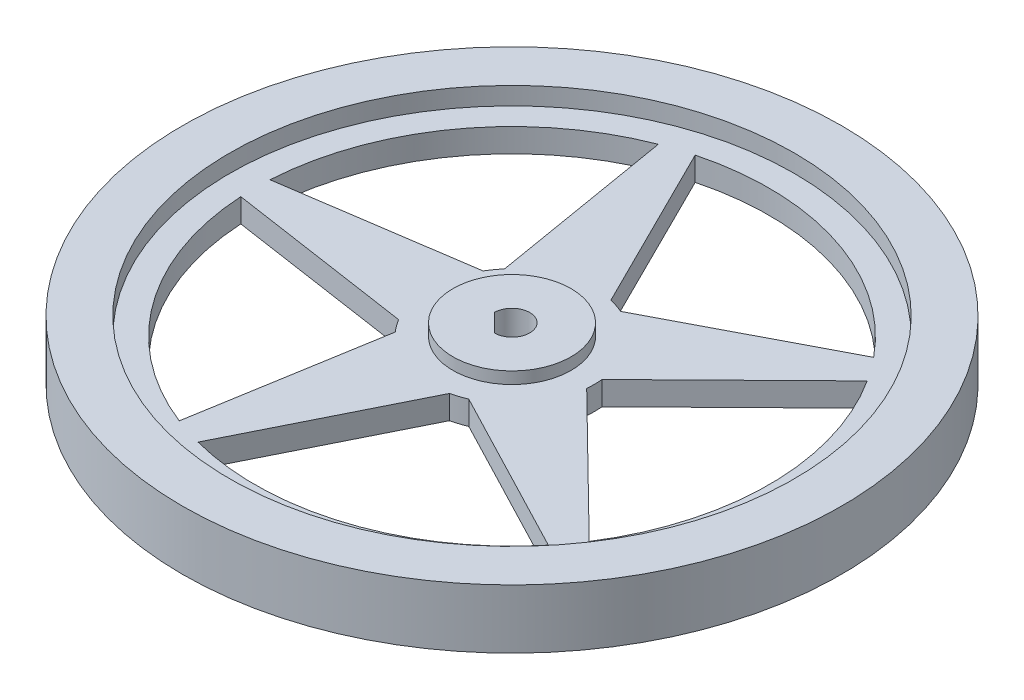
ISO-10303-21;
HEADER;
FILE_DESCRIPTION(('STEP AP214'),'2;1');
FILE_NAME('part.step','',(''),(''),'','','');
FILE_SCHEMA(('AUTOMOTIVE_DESIGN { 1 0 10303 214 1 1 1 1 }'));
ENDSEC;
DATA;
#1=APPLICATION_CONTEXT('core data for automotive mechanical design processes');
#2=APPLICATION_PROTOCOL_DEFINITION('international standard','automotive_design',2000,#1);
#3=PRODUCT_CONTEXT('',#1,'mechanical');
#4=PRODUCT('Part','Part','',(#3));
#5=PRODUCT_RELATED_PRODUCT_CATEGORY('part','',(#4));
#6=PRODUCT_DEFINITION_FORMATION('','',#4);
#7=PRODUCT_DEFINITION_CONTEXT('part definition',#1,'design');
#8=PRODUCT_DEFINITION('design','',#6,#7);
#9=PRODUCT_DEFINITION_SHAPE('','',#8);
#10=(LENGTH_UNIT() NAMED_UNIT(*) SI_UNIT(.MILLI.,.METRE.));
#11=(NAMED_UNIT(*) PLANE_ANGLE_UNIT() SI_UNIT($,.RADIAN.));
#12=(NAMED_UNIT(*) SI_UNIT($,.STERADIAN.) SOLID_ANGLE_UNIT());
#13=UNCERTAINTY_MEASURE_WITH_UNIT(LENGTH_MEASURE(1.E-05),#10,'distance_accuracy_value','');
#14=(GEOMETRIC_REPRESENTATION_CONTEXT(3) GLOBAL_UNCERTAINTY_ASSIGNED_CONTEXT((#13)) GLOBAL_UNIT_ASSIGNED_CONTEXT((#10,
#11,#12)) REPRESENTATION_CONTEXT('',''));
#15=CARTESIAN_POINT('',(0.,0.,0.));
#16=DIRECTION('',(0.,0.,1.));
#17=DIRECTION('',(1.,0.,0.));
#18=AXIS2_PLACEMENT_3D('',#15,#16,#17);
#19=CARTESIAN_POINT('',(0.,-2.00000000000001,45.78));
#20=DIRECTION('',(0.,-1.,0.));
#21=DIRECTION('',(0.,0.,-1.));
#22=AXIS2_PLACEMENT_3D('',#19,#20,#21);
#23=PLANE('',#22);
#24=CARTESIAN_POINT('',(0.,-2.00000000000001,55.78));
#25=DIRECTION('',(0.,-1.,0.));
#26=DIRECTION('',(0.,0.,-1.));
#27=AXIS2_PLACEMENT_3D('',#24,#25,#26);
#28=CIRCLE('',#27,43.5);
#29=CARTESIAN_POINT('',(36.5896617385151,-2.00000000000001,32.2545530571459));
#30=VERTEX_POINT('',#29);
#31=CARTESIAN_POINT('',(36.5896617385155,-2.00000000000001,79.3054469428536));
#32=VERTEX_POINT('',#31);
#33=EDGE_CURVE('E308',#30,#32,#28,.T.);
#34=ORIENTED_EDGE('',*,*,#33,.F.);
#35=DIRECTION('',(-0.713731855635448,0.,0.700419044751911));
#36=VECTOR('',#35,1.);
#37=CARTESIAN_POINT('',(34.0748247412753,-2.00000000000001,34.7224823129379));
#38=LINE('',#37,#36);
#39=CARTESIAN_POINT('',(13.9397019830941,-2.00000000000001,54.4820367406881));
#40=VERTEX_POINT('',#39);
#41=EDGE_CURVE('E303',#30,#40,#38,.T.);
#42=ORIENTED_EDGE('',*,*,#41,.T.);
#43=CARTESIAN_POINT('',(0.,-2.00000000000001,55.78));
#44=DIRECTION('',(0.,-1.,0.));
#45=DIRECTION('',(0.,0.,-1.));
#46=AXIS2_PLACEMENT_3D('',#43,#44,#45);
#47=CIRCLE('',#46,14.);
#48=CARTESIAN_POINT('',(13.9397019830941,-2.00000000000001,57.0779632593117));
#49=VERTEX_POINT('',#48);
#50=EDGE_CURVE('E314',#40,#49,#47,.T.);
#51=ORIENTED_EDGE('',*,*,#50,.T.);
#52=DIRECTION('',(-0.713731855635458,0.,-0.700419044751901));
#53=VECTOR('',#52,1.);
#54=CARTESIAN_POINT('',(-21.6952893172474,-2.00000000000001,22.1076500117612));
#55=LINE('',#54,#53);
#56=EDGE_CURVE('E311',#32,#49,#55,.T.);
#57=ORIENTED_EDGE('',*,*,#56,.F.);
#58=EDGE_LOOP('',(#34,#42,#51,#57));
#59=FACE_BOUND('',#58,.T.);
#60=CARTESIAN_POINT('',(0.,-2.00000000000001,55.78));
#61=DIRECTION('',(0.,-1.,0.));
#62=DIRECTION('',(0.,0.,-1.));
#63=AXIS2_PLACEMENT_3D('',#60,#61,#62);
#64=CIRCLE('',#63,43.5);
#65=CARTESIAN_POINT('',(-15.7737473982911,-2.00000000000001,96.3193499333044));
#66=VERTEX_POINT('',#65);
#67=CARTESIAN_POINT('',(-43.4295689314882,-2.00000000000001,58.2543771792346));
#68=VERTEX_POINT('',#67);
#69=EDGE_CURVE('E350',#66,#68,#64,.T.);
#70=ORIENTED_EDGE('',*,*,#69,.F.);
#71=DIRECTION('',(0.165725215705895,0.,-0.986171969222019));
#72=VECTOR('',#71,1.);
#73=CARTESIAN_POINT('',(0.401290642704826,-2.00000000000001,0.0674364922128934));
#74=LINE('',#73,#72);
#75=CARTESIAN_POINT('',(-10.5145321390043,-2.00000000000001,65.0236255818723));
#76=VERTEX_POINT('',#75);
#77=EDGE_CURVE('E341',#66,#76,#74,.T.);
#78=ORIENTED_EDGE('',*,*,#77,.T.);
#79=CARTESIAN_POINT('',(0.,-2.00000000000001,55.78));
#80=DIRECTION('',(0.,-1.,0.));
#81=DIRECTION('',(0.,0.,-1.));
#82=AXIS2_PLACEMENT_3D('',#79,#80,#81);
#83=CIRCLE('',#82,14.);
#84=CARTESIAN_POINT('',(-12.0403794626862,-2.00000000000001,62.9234769121573));
#85=VERTEX_POINT('',#84);
#86=EDGE_CURVE('E356',#76,#85,#83,.T.);
#87=ORIENTED_EDGE('',*,*,#86,.T.);
#88=DIRECTION('',(0.989117185565801,0.,0.147129851554298));
#89=VECTOR('',#88,1.);
#90=CARTESIAN_POINT('',(-9.41780999283275,-2.00000000000001,63.3135805949375));
#91=LINE('',#90,#89);
#92=EDGE_CURVE('E353',#68,#85,#91,.T.);
#93=ORIENTED_EDGE('',*,*,#92,.F.);
#94=EDGE_LOOP('',(#70,#78,#87,#93));
#95=FACE_BOUND('',#94,.T.);
#96=CARTESIAN_POINT('',(0.,-2.00000000000001,55.78));
#97=DIRECTION('',(0.,-1.,0.));
#98=DIRECTION('',(0.,0.,-1.));
#99=AXIS2_PLACEMENT_3D('',#96,#97,#98);
#100=CIRCLE('',#99,10.);
#101=CARTESIAN_POINT('',(0.,-2.00000000000001,45.78));
#102=VERTEX_POINT('',#101);
#103=EDGE_CURVE('E423',#102,#102,#100,.T.);
#104=ORIENTED_EDGE('',*,*,#103,.F.);
#105=EDGE_LOOP('',(#104));
#106=FACE_BOUND('',#105,.T.);
#107=CARTESIAN_POINT('',(0.,-2.,55.78));
#108=DIRECTION('',(0.,-1.,0.));
#109=DIRECTION('',(0.,0.,-1.));
#110=AXIS2_PLACEMENT_3D('',#107,#108,#109);
#111=CIRCLE('',#110,47.78);
#112=CARTESIAN_POINT('',(0.,-2.,8.));
#113=VERTEX_POINT('',#112);
#114=EDGE_CURVE('E420',#113,#113,#111,.T.);
#115=ORIENTED_EDGE('',*,*,#114,.T.);
#116=EDGE_LOOP('',(#115));
#117=FACE_BOUND('',#116,.T.);
#118=CARTESIAN_POINT('',(0.,-2.00000000000001,55.78));
#119=DIRECTION('',(0.,-1.,0.));
#120=DIRECTION('',(0.,0.,-1.));
#121=AXIS2_PLACEMENT_3D('',#118,#119,#120);
#122=CIRCLE('',#121,43.5);
#123=CARTESIAN_POINT('',(-43.4295689314882,-2.00000000000001,53.3056228207654));
#124=VERTEX_POINT('',#123);
#125=CARTESIAN_POINT('',(-15.7737473982916,-2.00000000000001,15.2406500666958));
#126=VERTEX_POINT('',#125);
#127=EDGE_CURVE('E371',#124,#126,#122,.T.);
#128=ORIENTED_EDGE('',*,*,#127,.F.);
#129=DIRECTION('',(0.989117185565801,0.,-0.147129851554298));
#130=VECTOR('',#129,1.);
#131=CARTESIAN_POINT('',(6.81736783910241,-2.00000000000001,45.831458529619));
#132=LINE('',#131,#130);
#133=CARTESIAN_POINT('',(-12.0403794626862,-2.00000000000001,48.6365230878427));
#134=VERTEX_POINT('',#133);
#135=EDGE_CURVE('E362',#124,#134,#132,.T.);
#136=ORIENTED_EDGE('',*,*,#135,.T.);
#137=CARTESIAN_POINT('',(0.,-2.00000000000001,55.78));
#138=DIRECTION('',(0.,-1.,0.));
#139=DIRECTION('',(0.,0.,-1.));
#140=AXIS2_PLACEMENT_3D('',#137,#138,#139);
#141=CIRCLE('',#140,14.);
#142=CARTESIAN_POINT('',(-10.5145321390045,-2.00000000000001,46.5363744181278));
#143=VERTEX_POINT('',#142);
#144=EDGE_CURVE('E377',#134,#143,#141,.T.);
#145=ORIENTED_EDGE('',*,*,#144,.T.);
#146=DIRECTION('',(0.165725215705909,0.,0.986171969222017));
#147=VECTOR('',#146,1.);
#148=CARTESIAN_POINT('',(-17.8313575699857,-2.00000000000001,2.99654185258007));
#149=LINE('',#148,#147);
#150=EDGE_CURVE('E374',#126,#143,#149,.T.);
#151=ORIENTED_EDGE('',*,*,#150,.F.);
#152=EDGE_LOOP('',(#128,#136,#145,#151));
#153=FACE_BOUND('',#152,.T.);
#154=CARTESIAN_POINT('',(0.,-2.00000000000001,55.78));
#155=DIRECTION('',(0.,-1.,0.));
#156=DIRECTION('',(0.,0.,-1.));
#157=AXIS2_PLACEMENT_3D('',#154,#155,#156);
#158=CIRCLE('',#157,43.5);
#159=CARTESIAN_POINT('',(33.6808569093892,-2.00000000000001,83.3090733198423));
#160=VERTEX_POINT('',#159);
#161=CARTESIAN_POINT('',(-11.0672023181249,-2.00000000000001,97.8485991310585));
#162=VERTEX_POINT('',#161);
#163=EDGE_CURVE('E329',#160,#162,#158,.T.);
#164=ORIENTED_EDGE('',*,*,#163,.F.);
#165=DIRECTION('',(-0.886693369466651,0.,-0.46235794417732));
#166=VECTOR('',#165,1.);
#167=CARTESIAN_POINT('',(-26.9540769892508,-2.00000000000001,51.6915555306137));
#168=LINE('',#167,#166);
#169=CARTESIAN_POINT('',(5.54204122497844,-2.00000000000001,68.6363517010324));
#170=VERTEX_POINT('',#169);
#171=EDGE_CURVE('E320',#160,#170,#168,.T.);
#172=ORIENTED_EDGE('',*,*,#171,.T.);
#173=CARTESIAN_POINT('',(0.,-2.00000000000001,55.78));
#174=DIRECTION('',(0.,-1.,0.));
#175=DIRECTION('',(0.,0.,-1.));
#176=AXIS2_PLACEMENT_3D('',#173,#174,#175);
#177=CIRCLE('',#176,14.);
#178=CARTESIAN_POINT('',(3.07316839361814,-2.00000000000001,69.4385371114357));
#179=VERTEX_POINT('',#178);
#180=EDGE_CURVE('E335',#170,#179,#177,.T.);
#181=ORIENTED_EDGE('',*,*,#180,.T.);
#182=DIRECTION('',(0.445582823830401,0.,-0.895240720201737));
#183=VECTOR('',#182,1.);
#184=CARTESIAN_POINT('',(30.1623115243284,-2.00000000000001,15.0125074060906));
#185=LINE('',#184,#183);
#186=EDGE_CURVE('E332',#162,#179,#185,.T.);
#187=ORIENTED_EDGE('',*,*,#186,.F.);
#188=EDGE_LOOP('',(#164,#172,#181,#187));
#189=FACE_BOUND('',#188,.T.);
#190=CARTESIAN_POINT('',(0.,-2.00000000000001,55.78));
#191=DIRECTION('',(0.,-1.,0.));
#192=DIRECTION('',(0.,0.,-1.));
#193=AXIS2_PLACEMENT_3D('',#190,#191,#192);
#194=CIRCLE('',#193,43.5);
#195=CARTESIAN_POINT('',(-11.0672023181255,-2.00000000000001,13.7114008689417));
#196=VERTEX_POINT('',#195);
#197=CARTESIAN_POINT('',(33.6808569093888,-2.00000000000001,28.2509266801572));
#198=VERTEX_POINT('',#197);
#199=EDGE_CURVE('E291',#196,#198,#194,.T.);
#200=ORIENTED_EDGE('',*,*,#199,.F.);
#201=DIRECTION('',(0.445582823830414,0.,0.895240720201731));
#202=VECTOR('',#201,1.);
#203=CARTESIAN_POINT('',(-14.3394062338321,-2.00000000000001,7.13706713461668));
#204=LINE('',#203,#202);
#205=CARTESIAN_POINT('',(3.07316839361794,-2.00000000000001,42.1214628885642));
#206=VERTEX_POINT('',#205);
#207=EDGE_CURVE('E145',#196,#206,#204,.T.);
#208=ORIENTED_EDGE('',*,*,#207,.T.);
#209=CARTESIAN_POINT('',(0.,-2.00000000000001,55.78));
#210=DIRECTION('',(0.,-1.,0.));
#211=DIRECTION('',(0.,0.,-1.));
#212=AXIS2_PLACEMENT_3D('',#209,#210,#211);
#213=CIRCLE('',#212,14.);
#214=CARTESIAN_POINT('',(5.54204122497826,-2.00000000000001,42.9236482989675));
#215=VERTEX_POINT('',#214);
#216=EDGE_CURVE('E296',#206,#215,#213,.T.);
#217=ORIENTED_EDGE('',*,*,#216,.T.);
#218=DIRECTION('',(-0.886693369466644,0.,0.462357944177333));
#219=VECTOR('',#218,1.);
#220=CARTESIAN_POINT('',(18.782145355737,-2.00000000000001,36.0197201346307));
#221=LINE('',#220,#219);
#222=EDGE_CURVE('E282',#198,#215,#221,.T.);
#223=ORIENTED_EDGE('',*,*,#222,.F.);
#224=EDGE_LOOP('',(#200,#208,#217,#223));
#225=FACE_BOUND('',#224,.T.);
#226=ADVANCED_FACE('F130',(#59,#95,#106,#117,#153,#189,#225),#23,.T.);
#227=CARTESIAN_POINT('',(0.,2.,45.78));
#228=DIRECTION('',(0.,1.,0.));
#229=DIRECTION('',(0.,0.,1.));
#230=AXIS2_PLACEMENT_3D('',#227,#228,#229);
#231=PLANE('',#230);
#232=CARTESIAN_POINT('',(0.,2.,55.78));
#233=DIRECTION('',(0.,1.,0.));
#234=DIRECTION('',(0.,0.,1.));
#235=AXIS2_PLACEMENT_3D('',#232,#233,#234);
#236=CIRCLE('',#235,14.);
#237=CARTESIAN_POINT('',(13.9397019830941,2.,57.0779632593117));
#238=VERTEX_POINT('',#237);
#239=CARTESIAN_POINT('',(13.9397019830941,2.,54.4820367406881));
#240=VERTEX_POINT('',#239);
#241=EDGE_CURVE('E472',#238,#240,#236,.T.);
#242=ORIENTED_EDGE('',*,*,#241,.T.);
#243=DIRECTION('',(0.713731855635448,0.,-0.700419044751911));
#244=VECTOR('',#243,1.);
#245=CARTESIAN_POINT('',(11.1888815573459,2.,57.1815477680769));
#246=LINE('',#245,#244);
#247=CARTESIAN_POINT('',(36.5896617385151,2.,32.2545530571459));
#248=VERTEX_POINT('',#247);
#249=EDGE_CURVE('E475',#240,#248,#246,.T.);
#250=ORIENTED_EDGE('',*,*,#249,.T.);
#251=CARTESIAN_POINT('',(0.,2.,55.78));
#252=DIRECTION('',(0.,1.,0.));
#253=DIRECTION('',(0.,0.,1.));
#254=AXIS2_PLACEMENT_3D('',#251,#252,#253);
#255=CIRCLE('',#254,43.5);
#256=CARTESIAN_POINT('',(36.5896617385154,2.,79.3054469428536));
#257=VERTEX_POINT('',#256);
#258=EDGE_CURVE('E467',#257,#248,#255,.T.);
#259=ORIENTED_EDGE('',*,*,#258,.F.);
#260=DIRECTION('',(0.713731855635458,0.,0.700419044751901));
#261=VECTOR('',#260,1.);
#262=CARTESIAN_POINT('',(1.19065386668203,2.,44.5667154668995));
#263=LINE('',#262,#261);
#264=EDGE_CURVE('E469',#238,#257,#263,.T.);
#265=ORIENTED_EDGE('',*,*,#264,.F.);
#266=EDGE_LOOP('',(#242,#250,#259,#265));
#267=FACE_BOUND('',#266,.T.);
#268=CARTESIAN_POINT('',(0.,2.,55.78));
#269=DIRECTION('',(0.,1.,0.));
#270=DIRECTION('',(0.,0.,1.));
#271=AXIS2_PLACEMENT_3D('',#268,#269,#270);
#272=CIRCLE('',#271,14.);
#273=CARTESIAN_POINT('',(-12.0403794626862,2.,62.9234769121573));
#274=VERTEX_POINT('',#273);
#275=CARTESIAN_POINT('',(-10.5145321390043,2.,65.0236255818723));
#276=VERTEX_POINT('',#275);
#277=EDGE_CURVE('E450',#274,#276,#272,.T.);
#278=ORIENTED_EDGE('',*,*,#277,.T.);
#279=DIRECTION('',(-0.165725215705895,0.,0.986171969222019));
#280=VECTOR('',#279,1.);
#281=CARTESIAN_POINT('',(-7.08069784041583,2.,44.5900957910243));
#282=LINE('',#281,#280);
#283=CARTESIAN_POINT('',(-15.7737473982911,2.,96.3193499333044));
#284=VERTEX_POINT('',#283);
#285=EDGE_CURVE('E453',#276,#284,#282,.T.);
#286=ORIENTED_EDGE('',*,*,#285,.T.);
#287=CARTESIAN_POINT('',(0.,2.,55.78));
#288=DIRECTION('',(0.,1.,0.));
#289=DIRECTION('',(0.,0.,1.));
#290=AXIS2_PLACEMENT_3D('',#287,#288,#289);
#291=CIRCLE('',#290,43.5);
#292=CARTESIAN_POINT('',(-43.4295689314882,2.,58.2543771792346));
#293=VERTEX_POINT('',#292);
#294=EDGE_CURVE('E445',#293,#284,#291,.T.);
#295=ORIENTED_EDGE('',*,*,#294,.F.);
#296=DIRECTION('',(-0.989117185565801,0.,-0.147129851554298));
#297=VECTOR('',#296,1.);
#298=CARTESIAN_POINT('',(-2.75550772368618,2.,64.3045891004754));
#299=LINE('',#298,#297);
#300=EDGE_CURVE('E447',#274,#293,#299,.T.);
#301=ORIENTED_EDGE('',*,*,#300,.F.);
#302=EDGE_LOOP('',(#278,#286,#295,#301));
#303=FACE_BOUND('',#302,.T.);
#304=CARTESIAN_POINT('',(0.,2.,55.78));
#305=DIRECTION('',(0.,-1.,0.));
#306=DIRECTION('',(0.,0.,-1.));
#307=AXIS2_PLACEMENT_3D('',#304,#305,#306);
#308=CIRCLE('',#307,47.78);
#309=CARTESIAN_POINT('',(0.,2.,8.));
#310=VERTEX_POINT('',#309);
#311=EDGE_CURVE('E405',#310,#310,#308,.T.);
#312=ORIENTED_EDGE('',*,*,#311,.F.);
#313=EDGE_LOOP('',(#312));
#314=FACE_BOUND('',#313,.T.);
#315=CARTESIAN_POINT('',(0.,2.,55.78));
#316=DIRECTION('',(0.,-1.,0.));
#317=DIRECTION('',(0.,0.,-1.));
#318=AXIS2_PLACEMENT_3D('',#315,#316,#317);
#319=CIRCLE('',#318,10.);
#320=CARTESIAN_POINT('',(0.,2.,45.78));
#321=VERTEX_POINT('',#320);
#322=EDGE_CURVE('E402',#321,#321,#319,.T.);
#323=ORIENTED_EDGE('',*,*,#322,.T.);
#324=EDGE_LOOP('',(#323));
#325=FACE_BOUND('',#324,.T.);
#326=CARTESIAN_POINT('',(0.,2.,55.78));
#327=DIRECTION('',(0.,1.,0.));
#328=DIRECTION('',(0.,0.,1.));
#329=AXIS2_PLACEMENT_3D('',#326,#327,#328);
#330=CIRCLE('',#329,14.);
#331=CARTESIAN_POINT('',(-10.5145321390045,2.,46.5363744181278));
#332=VERTEX_POINT('',#331);
#333=CARTESIAN_POINT('',(-12.0403794626862,2.,48.6365230878427));
#334=VERTEX_POINT('',#333);
#335=EDGE_CURVE('E439',#332,#334,#330,.T.);
#336=ORIENTED_EDGE('',*,*,#335,.T.);
#337=DIRECTION('',(-0.989117185565801,0.,0.147129851554298));
#338=VECTOR('',#337,1.);
#339=CARTESIAN_POINT('',(0.155065569955836,2.,46.8224670351568));
#340=LINE('',#339,#338);
#341=CARTESIAN_POINT('',(-43.4295689314882,2.,53.3056228207654));
#342=VERTEX_POINT('',#341);
#343=EDGE_CURVE('E442',#334,#342,#340,.T.);
#344=ORIENTED_EDGE('',*,*,#343,.T.);
#345=CARTESIAN_POINT('',(0.,2.,55.78));
#346=DIRECTION('',(0.,1.,0.));
#347=DIRECTION('',(0.,0.,1.));
#348=AXIS2_PLACEMENT_3D('',#345,#346,#347);
#349=CIRCLE('',#348,43.5);
#350=CARTESIAN_POINT('',(-15.7737473982916,2.,15.2406500666959));
#351=VERTEX_POINT('',#350);
#352=EDGE_CURVE('E434',#351,#342,#349,.T.);
#353=ORIENTED_EDGE('',*,*,#352,.F.);
#354=DIRECTION('',(-0.165725215705909,0.,-0.986171969222017));
#355=VECTOR('',#354,1.);
#356=CARTESIAN_POINT('',(-10.3493690868645,2.,47.5192011513912));
#357=LINE('',#356,#355);
#358=EDGE_CURVE('E436',#332,#351,#357,.T.);
#359=ORIENTED_EDGE('',*,*,#358,.F.);
#360=EDGE_LOOP('',(#336,#344,#353,#359));
#361=FACE_BOUND('',#360,.T.);
#362=CARTESIAN_POINT('',(0.,2.,55.78));
#363=DIRECTION('',(0.,1.,0.));
#364=DIRECTION('',(0.,0.,1.));
#365=AXIS2_PLACEMENT_3D('',#362,#363,#364);
#366=CIRCLE('',#365,14.);
#367=CARTESIAN_POINT('',(3.07316839361814,2.,69.4385371114357));
#368=VERTEX_POINT('',#367);
#369=CARTESIAN_POINT('',(5.54204122497844,2.,68.6363517010324));
#370=VERTEX_POINT('',#369);
#371=EDGE_CURVE('E461',#368,#370,#366,.T.);
#372=ORIENTED_EDGE('',*,*,#371,.T.);
#373=DIRECTION('',(0.886693369466651,0.,0.46235794417732));
#374=VECTOR('',#373,1.);
#375=CARTESIAN_POINT('',(-8.18566305097969,2.,61.4781690125524));
#376=LINE('',#375,#374);
#377=CARTESIAN_POINT('',(33.6808569093892,2.,83.3090733198423));
#378=VERTEX_POINT('',#377);
#379=EDGE_CURVE('E464',#370,#378,#376,.T.);
#380=ORIENTED_EDGE('',*,*,#379,.T.);
#381=CARTESIAN_POINT('',(0.,2.,55.78));
#382=DIRECTION('',(0.,1.,0.));
#383=DIRECTION('',(0.,0.,1.));
#384=AXIS2_PLACEMENT_3D('',#381,#382,#383);
#385=CIRCLE('',#384,43.5);
#386=CARTESIAN_POINT('',(-11.0672023181248,2.,97.8485991310584));
#387=VERTEX_POINT('',#386);
#388=EDGE_CURVE('E456',#387,#378,#385,.T.);
#389=ORIENTED_EDGE('',*,*,#388,.F.);
#390=DIRECTION('',(-0.445582823830401,0.,0.895240720201737));
#391=VECTOR('',#390,1.);
#392=CARTESIAN_POINT('',(11.900491526403,2.,51.703160664664));
#393=LINE('',#392,#391);
#394=EDGE_CURVE('E458',#368,#387,#393,.T.);
#395=ORIENTED_EDGE('',*,*,#394,.F.);
#396=EDGE_LOOP('',(#372,#380,#389,#395));
#397=FACE_BOUND('',#396,.T.);
#398=CARTESIAN_POINT('',(0.,2.,55.78));
#399=DIRECTION('',(0.,1.,0.));
#400=DIRECTION('',(0.,0.,1.));
#401=AXIS2_PLACEMENT_3D('',#398,#399,#400);
#402=CIRCLE('',#401,14.);
#403=CARTESIAN_POINT('',(5.54204122497826,2.,42.9236482989675));
#404=VERTEX_POINT('',#403);
#405=CARTESIAN_POINT('',(3.07316839361794,2.,42.1214628885642));
#406=VERTEX_POINT('',#405);
#407=EDGE_CURVE('E138',#404,#406,#402,.T.);
#408=ORIENTED_EDGE('',*,*,#407,.T.);
#409=DIRECTION('',(-0.445582823830414,0.,-0.895240720201731));
#410=VECTOR('',#409,1.);
#411=CARTESIAN_POINT('',(3.92241376409375,2.,43.8277203931895));
#412=LINE('',#411,#410);
#413=CARTESIAN_POINT('',(-11.0672023181255,2.,13.7114008689417));
#414=VERTEX_POINT('',#413);
#415=EDGE_CURVE('E12',#406,#414,#412,.T.);
#416=ORIENTED_EDGE('',*,*,#415,.T.);
#417=CARTESIAN_POINT('',(0.,2.,55.78));
#418=DIRECTION('',(0.,1.,0.));
#419=DIRECTION('',(0.,0.,1.));
#420=AXIS2_PLACEMENT_3D('',#417,#418,#419);
#421=CIRCLE('',#420,43.5);
#422=CARTESIAN_POINT('',(33.6808569093888,2.,28.2509266801572));
#423=VERTEX_POINT('',#422);
#424=EDGE_CURVE('E478',#423,#414,#421,.T.);
#425=ORIENTED_EDGE('',*,*,#424,.F.);
#426=DIRECTION('',(0.886693369466644,0.,-0.462357944177333));
#427=VECTOR('',#426,1.);
#428=CARTESIAN_POINT('',(0.0137314174655113,2.,45.80633361657));
#429=LINE('',#428,#427);
#430=EDGE_CURVE('E285',#404,#423,#429,.T.);
#431=ORIENTED_EDGE('',*,*,#430,.F.);
#432=EDGE_LOOP('',(#408,#416,#425,#431));
#433=FACE_BOUND('',#432,.T.);
#434=ADVANCED_FACE('F482',(#267,#303,#314,#325,#361,#397,#433),#231,.T.);
#435=CARTESIAN_POINT('',(0.,-4.00000000000001,55.78));
#436=DIRECTION('',(0.,-1.,0.));
#437=DIRECTION('',(0.,0.,-1.));
#438=AXIS2_PLACEMENT_3D('',#435,#436,#437);
#439=PLANE('',#438);
#440=CARTESIAN_POINT('',(0.,-4.00000000000001,55.78));
#441=DIRECTION('',(0.,-1.,0.));
#442=DIRECTION('',(0.,0.,-1.));
#443=AXIS2_PLACEMENT_3D('',#440,#441,#442);
#444=CIRCLE('',#443,3.);
#445=CARTESIAN_POINT('',(-3.,-4.00000000000001,55.78));
#446=VERTEX_POINT('',#445);
#447=CARTESIAN_POINT('',(0.,-4.00000000000001,58.78));
#448=VERTEX_POINT('',#447);
#449=EDGE_CURVE('E383',#446,#448,#444,.T.);
#450=ORIENTED_EDGE('',*,*,#449,.F.);
#451=DIRECTION('',(-0.707106781186547,0.,-0.707106781186548));
#452=VECTOR('',#451,1.);
#453=CARTESIAN_POINT('',(-3.,-4.00000000000001,55.78));
#454=LINE('',#453,#452);
#455=EDGE_CURVE('E391',#448,#446,#454,.T.);
#456=ORIENTED_EDGE('',*,*,#455,.F.);
#457=EDGE_LOOP('',(#450,#456));
#458=FACE_BOUND('',#457,.T.);
#459=CARTESIAN_POINT('',(0.,-4.00000000000001,55.78));
#460=DIRECTION('',(0.,-1.,0.));
#461=DIRECTION('',(0.,0.,-1.));
#462=AXIS2_PLACEMENT_3D('',#459,#460,#461);
#463=CIRCLE('',#462,10.);
#464=CARTESIAN_POINT('',(0.,-4.00000000000001,45.78));
#465=VERTEX_POINT('',#464);
#466=EDGE_CURVE('E426',#465,#465,#463,.T.);
#467=ORIENTED_EDGE('',*,*,#466,.T.);
#468=EDGE_LOOP('',(#467));
#469=FACE_BOUND('',#468,.T.);
#470=ADVANCED_FACE('F132',(#458,#469),#439,.T.);
#471=CARTESIAN_POINT('',(0.,-4.00000000000001,55.78));
#472=DIRECTION('',(0.,-1.,0.));
#473=DIRECTION('',(0.,0.,-1.));
#474=AXIS2_PLACEMENT_3D('',#471,#472,#473);
#475=CYLINDRICAL_SURFACE('',#474,10.);
#476=ORIENTED_EDGE('',*,*,#103,.T.);
#477=EDGE_LOOP('',(#476));
#478=FACE_BOUND('',#477,.T.);
#479=ORIENTED_EDGE('',*,*,#466,.F.);
#480=EDGE_LOOP('',(#479));
#481=FACE_BOUND('',#480,.T.);
#482=ADVANCED_FACE('F513',(#478,#481),#475,.T.);
#483=CARTESIAN_POINT('',(0.,-4.00000000000001,55.78));
#484=DIRECTION('',(0.,-1.,0.));
#485=DIRECTION('',(0.,0.,-1.));
#486=AXIS2_PLACEMENT_3D('',#483,#484,#485);
#487=CYLINDRICAL_SURFACE('',#486,47.78);
#488=CARTESIAN_POINT('',(0.,-5.,55.78));
#489=DIRECTION('',(0.,-1.,0.));
#490=DIRECTION('',(0.,0.,-1.));
#491=AXIS2_PLACEMENT_3D('',#488,#489,#490);
#492=CIRCLE('',#491,47.78);
#493=CARTESIAN_POINT('',(0.,-5.,8.));
#494=VERTEX_POINT('',#493);
#495=EDGE_CURVE('E417',#494,#494,#492,.T.);
#496=ORIENTED_EDGE('',*,*,#495,.T.);
#497=EDGE_LOOP('',(#496));
#498=FACE_BOUND('',#497,.T.);
#499=ORIENTED_EDGE('',*,*,#114,.F.);
#500=EDGE_LOOP('',(#499));
#501=FACE_BOUND('',#500,.T.);
#502=ADVANCED_FACE('F511',(#498,#501),#487,.F.);
#503=CARTESIAN_POINT('',(0.,-5.,8.));
#504=DIRECTION('',(0.,-1.,0.));
#505=DIRECTION('',(0.,0.,-1.));
#506=AXIS2_PLACEMENT_3D('',#503,#504,#505);
#507=PLANE('',#506);
#508=CARTESIAN_POINT('',(0.,-5.,55.78));
#509=DIRECTION('',(0.,-1.,0.));
#510=DIRECTION('',(0.,0.,-1.));
#511=AXIS2_PLACEMENT_3D('',#508,#509,#510);
#512=CIRCLE('',#511,55.78);
#513=CARTESIAN_POINT('',(0.,-5.,0.));
#514=VERTEX_POINT('',#513);
#515=EDGE_CURVE('E414',#514,#514,#512,.T.);
#516=ORIENTED_EDGE('',*,*,#515,.T.);
#517=EDGE_LOOP('',(#516));
#518=FACE_BOUND('',#517,.T.);
#519=ORIENTED_EDGE('',*,*,#495,.F.);
#520=EDGE_LOOP('',(#519));
#521=FACE_BOUND('',#520,.T.);
#522=ADVANCED_FACE('F520',(#518,#521),#507,.T.);
#523=CARTESIAN_POINT('',(0.,-4.00000000000001,55.78));
#524=DIRECTION('',(0.,-1.,0.));
#525=DIRECTION('',(0.,0.,-1.));
#526=AXIS2_PLACEMENT_3D('',#523,#524,#525);
#527=CYLINDRICAL_SURFACE('',#526,55.78);
#528=CARTESIAN_POINT('',(0.,5.,55.78));
#529=DIRECTION('',(0.,-1.,0.));
#530=DIRECTION('',(0.,0.,-1.));
#531=AXIS2_PLACEMENT_3D('',#528,#529,#530);
#532=CIRCLE('',#531,55.78);
#533=CARTESIAN_POINT('',(0.,5.,0.));
#534=VERTEX_POINT('',#533);
#535=EDGE_CURVE('E411',#534,#534,#532,.T.);
#536=ORIENTED_EDGE('',*,*,#535,.T.);
#537=EDGE_LOOP('',(#536));
#538=FACE_BOUND('',#537,.T.);
#539=ORIENTED_EDGE('',*,*,#515,.F.);
#540=EDGE_LOOP('',(#539));
#541=FACE_BOUND('',#540,.T.);
#542=ADVANCED_FACE('F619',(#538,#541),#527,.T.);
#543=CARTESIAN_POINT('',(0.,5.,8.));
#544=DIRECTION('',(0.,1.,0.));
#545=DIRECTION('',(0.,0.,1.));
#546=AXIS2_PLACEMENT_3D('',#543,#544,#545);
#547=PLANE('',#546);
#548=CARTESIAN_POINT('',(0.,5.,55.78));
#549=DIRECTION('',(0.,-1.,0.));
#550=DIRECTION('',(0.,0.,-1.));
#551=AXIS2_PLACEMENT_3D('',#548,#549,#550);
#552=CIRCLE('',#551,47.78);
#553=CARTESIAN_POINT('',(0.,5.,8.));
#554=VERTEX_POINT('',#553);
#555=EDGE_CURVE('E408',#554,#554,#552,.T.);
#556=ORIENTED_EDGE('',*,*,#555,.T.);
#557=EDGE_LOOP('',(#556));
#558=FACE_BOUND('',#557,.T.);
#559=ORIENTED_EDGE('',*,*,#535,.F.);
#560=EDGE_LOOP('',(#559));
#561=FACE_BOUND('',#560,.T.);
#562=ADVANCED_FACE('F615',(#558,#561),#547,.T.);
#563=CARTESIAN_POINT('',(0.,-4.00000000000001,55.78));
#564=DIRECTION('',(0.,-1.,0.));
#565=DIRECTION('',(0.,0.,-1.));
#566=AXIS2_PLACEMENT_3D('',#563,#564,#565);
#567=CYLINDRICAL_SURFACE('',#566,47.78);
#568=ORIENTED_EDGE('',*,*,#311,.T.);
#569=EDGE_LOOP('',(#568));
#570=FACE_BOUND('',#569,.T.);
#571=ORIENTED_EDGE('',*,*,#555,.F.);
#572=EDGE_LOOP('',(#571));
#573=FACE_BOUND('',#572,.T.);
#574=ADVANCED_FACE('F610',(#570,#573),#567,.F.);
#575=CARTESIAN_POINT('',(0.,-4.00000000000001,55.78));
#576=DIRECTION('',(0.,-1.,0.));
#577=DIRECTION('',(0.,0.,-1.));
#578=AXIS2_PLACEMENT_3D('',#575,#576,#577);
#579=CYLINDRICAL_SURFACE('',#578,10.);
#580=CARTESIAN_POINT('',(0.,3.99999999999999,55.78));
#581=DIRECTION('',(0.,-1.,0.));
#582=DIRECTION('',(0.,0.,-1.));
#583=AXIS2_PLACEMENT_3D('',#580,#581,#582);
#584=CIRCLE('',#583,10.);
#585=CARTESIAN_POINT('',(0.,3.99999999999999,45.78));
#586=VERTEX_POINT('',#585);
#587=EDGE_CURVE('E397',#586,#586,#584,.T.);
#588=ORIENTED_EDGE('',*,*,#587,.T.);
#589=EDGE_LOOP('',(#588));
#590=FACE_BOUND('',#589,.T.);
#591=ORIENTED_EDGE('',*,*,#322,.F.);
#592=EDGE_LOOP('',(#591));
#593=FACE_BOUND('',#592,.T.);
#594=ADVANCED_FACE('F607',(#590,#593),#579,.T.);
#595=CARTESIAN_POINT('',(0.,3.99999999999999,55.78));
#596=DIRECTION('',(0.,1.,0.));
#597=DIRECTION('',(0.,0.,1.));
#598=AXIS2_PLACEMENT_3D('',#595,#596,#597);
#599=PLANE('',#598);
#600=CARTESIAN_POINT('',(0.,3.99999999999999,55.78));
#601=DIRECTION('',(0.,1.,0.));
#602=DIRECTION('',(0.,0.,1.));
#603=AXIS2_PLACEMENT_3D('',#600,#601,#602);
#604=CIRCLE('',#603,3.);
#605=CARTESIAN_POINT('',(0.,3.99999999999999,58.78));
#606=VERTEX_POINT('',#605);
#607=CARTESIAN_POINT('',(-3.,3.99999999999999,55.78));
#608=VERTEX_POINT('',#607);
#609=EDGE_CURVE('E431',#606,#608,#604,.T.);
#610=ORIENTED_EDGE('',*,*,#609,.F.);
#611=DIRECTION('',(0.707106781186547,0.,0.707106781186548));
#612=VECTOR('',#611,1.);
#613=CARTESIAN_POINT('',(-1.5,3.99999999999999,57.28));
#614=LINE('',#613,#612);
#615=EDGE_CURVE('E429',#608,#606,#614,.T.);
#616=ORIENTED_EDGE('',*,*,#615,.F.);
#617=EDGE_LOOP('',(#610,#616));
#618=FACE_BOUND('',#617,.T.);
#619=ORIENTED_EDGE('',*,*,#587,.F.);
#620=EDGE_LOOP('',(#619));
#621=FACE_BOUND('',#620,.T.);
#622=ADVANCED_FACE('F603',(#618,#621),#599,.T.);
#623=CARTESIAN_POINT('',(0.,5.99999999999999,55.78));
#624=DIRECTION('',(0.,-1.,0.));
#625=DIRECTION('',(0.,0.,-1.));
#626=AXIS2_PLACEMENT_3D('',#623,#624,#625);
#627=CYLINDRICAL_SURFACE('',#626,3.);
#628=ORIENTED_EDGE('',*,*,#609,.T.);
#629=DIRECTION('',(0.,-1.,0.));
#630=VECTOR('',#629,1.);
#631=CARTESIAN_POINT('',(-3.,5.99999999999999,55.78));
#632=LINE('',#631,#630);
#633=EDGE_CURVE('E395',#608,#446,#632,.T.);
#634=ORIENTED_EDGE('',*,*,#633,.T.);
#635=ORIENTED_EDGE('',*,*,#449,.T.);
#636=DIRECTION('',(0.,-1.,0.));
#637=VECTOR('',#636,1.);
#638=CARTESIAN_POINT('',(0.,5.99999999999999,58.78));
#639=LINE('',#638,#637);
#640=EDGE_CURVE('E394',#606,#448,#639,.T.);
#641=ORIENTED_EDGE('',*,*,#640,.F.);
#642=EDGE_LOOP('',(#628,#634,#635,#641));
#643=FACE_BOUND('',#642,.T.);
#644=ADVANCED_FACE('F599',(#643),#627,.F.);
#645=CARTESIAN_POINT('',(-3.,5.99999999999999,55.78));
#646=DIRECTION('',(-0.707106781186548,0.,0.707106781186547));
#647=DIRECTION('',(0.707106781186547,0.,0.707106781186548));
#648=AXIS2_PLACEMENT_3D('',#645,#646,#647);
#649=PLANE('',#648);
#650=ORIENTED_EDGE('',*,*,#615,.T.);
#651=ORIENTED_EDGE('',*,*,#640,.T.);
#652=ORIENTED_EDGE('',*,*,#455,.T.);
#653=ORIENTED_EDGE('',*,*,#633,.F.);
#654=EDGE_LOOP('',(#650,#651,#652,#653));
#655=FACE_BOUND('',#654,.T.);
#656=ADVANCED_FACE('F595',(#655),#649,.F.);
#657=CARTESIAN_POINT('',(6.81736783910241,7.99999999999999,45.831458529619));
#658=DIRECTION('',(-0.147129851554298,0.,-0.989117185565801));
#659=DIRECTION('',(-0.989117185565801,0.,0.147129851554298));
#660=AXIS2_PLACEMENT_3D('',#657,#658,#659);
#661=PLANE('',#660);
#662=DIRECTION('',(0.,-1.,0.));
#663=VECTOR('',#662,1.);
#664=CARTESIAN_POINT('',(-12.0403794626862,7.99999999999999,48.6365230878427));
#665=LINE('',#664,#663);
#666=EDGE_CURVE('E381',#334,#134,#665,.T.);
#667=ORIENTED_EDGE('',*,*,#666,.T.);
#668=ORIENTED_EDGE('',*,*,#135,.F.);
#669=DIRECTION('',(0.,-1.,0.));
#670=VECTOR('',#669,1.);
#671=CARTESIAN_POINT('',(-43.4295689314882,7.99999999999999,53.3056228207654));
#672=LINE('',#671,#670);
#673=EDGE_CURVE('E380',#342,#124,#672,.T.);
#674=ORIENTED_EDGE('',*,*,#673,.F.);
#675=ORIENTED_EDGE('',*,*,#343,.F.);
#676=EDGE_LOOP('',(#667,#668,#674,#675));
#677=FACE_BOUND('',#676,.T.);
#678=ADVANCED_FACE('F585',(#677),#661,.T.);
#679=CARTESIAN_POINT('',(0.,7.99999999999999,55.78));
#680=DIRECTION('',(0.,-1.,0.));
#681=DIRECTION('',(0.,0.,-1.));
#682=AXIS2_PLACEMENT_3D('',#679,#680,#681);
#683=CYLINDRICAL_SURFACE('',#682,14.);
#684=DIRECTION('',(0.,-1.,0.));
#685=VECTOR('',#684,1.);
#686=CARTESIAN_POINT('',(-10.5145321390045,7.99999999999999,46.5363744181278));
#687=LINE('',#686,#685);
#688=EDGE_CURVE('E384',#332,#143,#687,.T.);
#689=ORIENTED_EDGE('',*,*,#688,.T.);
#690=ORIENTED_EDGE('',*,*,#144,.F.);
#691=ORIENTED_EDGE('',*,*,#666,.F.);
#692=ORIENTED_EDGE('',*,*,#335,.F.);
#693=EDGE_LOOP('',(#689,#690,#691,#692));
#694=FACE_BOUND('',#693,.T.);
#695=ADVANCED_FACE('F581',(#694),#683,.T.);
#696=CARTESIAN_POINT('',(-17.8313575699857,7.99999999999999,2.99654185258007));
#697=DIRECTION('',(0.986171969222017,0.,-0.165725215705909));
#698=DIRECTION('',(-0.165725215705909,0.,-0.986171969222017));
#699=AXIS2_PLACEMENT_3D('',#696,#697,#698);
#700=PLANE('',#699);
#701=ORIENTED_EDGE('',*,*,#358,.T.);
#702=DIRECTION('',(0.,-1.,0.));
#703=VECTOR('',#702,1.);
#704=CARTESIAN_POINT('',(-15.7737473982916,7.99999999999999,15.2406500666958));
#705=LINE('',#704,#703);
#706=EDGE_CURVE('E386',#351,#126,#705,.T.);
#707=ORIENTED_EDGE('',*,*,#706,.T.);
#708=ORIENTED_EDGE('',*,*,#150,.T.);
#709=ORIENTED_EDGE('',*,*,#688,.F.);
#710=EDGE_LOOP('',(#701,#707,#708,#709));
#711=FACE_BOUND('',#710,.T.);
#712=ADVANCED_FACE('F584',(#711),#700,.F.);
#713=CARTESIAN_POINT('',(0.,7.99999999999999,55.78));
#714=DIRECTION('',(0.,-1.,0.));
#715=DIRECTION('',(0.,0.,-1.));
#716=AXIS2_PLACEMENT_3D('',#713,#714,#715);
#717=CYLINDRICAL_SURFACE('',#716,43.5);
#718=ORIENTED_EDGE('',*,*,#352,.T.);
#719=ORIENTED_EDGE('',*,*,#673,.T.);
#720=ORIENTED_EDGE('',*,*,#127,.T.);
#721=ORIENTED_EDGE('',*,*,#706,.F.);
#722=EDGE_LOOP('',(#718,#719,#720,#721));
#723=FACE_BOUND('',#722,.T.);
#724=ADVANCED_FACE('F579',(#723),#717,.F.);
#725=CARTESIAN_POINT('',(0.401290642704826,7.99999999999999,0.0674364922128934));
#726=DIRECTION('',(-0.986171969222019,0.,-0.165725215705895));
#727=DIRECTION('',(-0.165725215705895,0.,0.986171969222019));
#728=AXIS2_PLACEMENT_3D('',#725,#726,#727);
#729=PLANE('',#728);
#730=DIRECTION('',(0.,-1.,0.));
#731=VECTOR('',#730,1.);
#732=CARTESIAN_POINT('',(-10.5145321390043,7.99999999999999,65.0236255818723));
#733=LINE('',#732,#731);
#734=EDGE_CURVE('E360',#276,#76,#733,.T.);
#735=ORIENTED_EDGE('',*,*,#734,.T.);
#736=ORIENTED_EDGE('',*,*,#77,.F.);
#737=DIRECTION('',(0.,-1.,0.));
#738=VECTOR('',#737,1.);
#739=CARTESIAN_POINT('',(-15.7737473982911,7.99999999999999,96.3193499333044));
#740=LINE('',#739,#738);
#741=EDGE_CURVE('E359',#284,#66,#740,.T.);
#742=ORIENTED_EDGE('',*,*,#741,.F.);
#743=ORIENTED_EDGE('',*,*,#285,.F.);
#744=EDGE_LOOP('',(#735,#736,#742,#743));
#745=FACE_BOUND('',#744,.T.);
#746=ADVANCED_FACE('F569',(#745),#729,.T.);
#747=CARTESIAN_POINT('',(0.,7.99999999999999,55.78));
#748=DIRECTION('',(0.,-1.,0.));
#749=DIRECTION('',(0.,0.,-1.));
#750=AXIS2_PLACEMENT_3D('',#747,#748,#749);
#751=CYLINDRICAL_SURFACE('',#750,14.);
#752=DIRECTION('',(0.,-1.,0.));
#753=VECTOR('',#752,1.);
#754=CARTESIAN_POINT('',(-12.0403794626862,7.99999999999999,62.9234769121573));
#755=LINE('',#754,#753);
#756=EDGE_CURVE('E363',#274,#85,#755,.T.);
#757=ORIENTED_EDGE('',*,*,#756,.T.);
#758=ORIENTED_EDGE('',*,*,#86,.F.);
#759=ORIENTED_EDGE('',*,*,#734,.F.);
#760=ORIENTED_EDGE('',*,*,#277,.F.);
#761=EDGE_LOOP('',(#757,#758,#759,#760));
#762=FACE_BOUND('',#761,.T.);
#763=ADVANCED_FACE('F565',(#762),#751,.T.);
#764=CARTESIAN_POINT('',(-9.41780999283275,7.99999999999999,63.3135805949375));
#765=DIRECTION('',(0.147129851554298,0.,-0.989117185565801));
#766=DIRECTION('',(-0.989117185565801,0.,-0.147129851554298));
#767=AXIS2_PLACEMENT_3D('',#764,#765,#766);
#768=PLANE('',#767);
#769=ORIENTED_EDGE('',*,*,#300,.T.);
#770=DIRECTION('',(0.,-1.,0.));
#771=VECTOR('',#770,1.);
#772=CARTESIAN_POINT('',(-43.4295689314882,7.99999999999999,58.2543771792346));
#773=LINE('',#772,#771);
#774=EDGE_CURVE('E365',#293,#68,#773,.T.);
#775=ORIENTED_EDGE('',*,*,#774,.T.);
#776=ORIENTED_EDGE('',*,*,#92,.T.);
#777=ORIENTED_EDGE('',*,*,#756,.F.);
#778=EDGE_LOOP('',(#769,#775,#776,#777));
#779=FACE_BOUND('',#778,.T.);
#780=ADVANCED_FACE('F568',(#779),#768,.F.);
#781=CARTESIAN_POINT('',(0.,7.99999999999999,55.78));
#782=DIRECTION('',(0.,-1.,0.));
#783=DIRECTION('',(0.,0.,-1.));
#784=AXIS2_PLACEMENT_3D('',#781,#782,#783);
#785=CYLINDRICAL_SURFACE('',#784,43.5);
#786=ORIENTED_EDGE('',*,*,#294,.T.);
#787=ORIENTED_EDGE('',*,*,#741,.T.);
#788=ORIENTED_EDGE('',*,*,#69,.T.);
#789=ORIENTED_EDGE('',*,*,#774,.F.);
#790=EDGE_LOOP('',(#786,#787,#788,#789));
#791=FACE_BOUND('',#790,.T.);
#792=ADVANCED_FACE('F564',(#791),#785,.F.);
#793=CARTESIAN_POINT('',(-26.9540769892508,7.99999999999999,51.6915555306137));
#794=DIRECTION('',(-0.46235794417732,0.,0.886693369466651));
#795=DIRECTION('',(0.886693369466651,0.,0.46235794417732));
#796=AXIS2_PLACEMENT_3D('',#793,#794,#795);
#797=PLANE('',#796);
#798=DIRECTION('',(0.,-1.,0.));
#799=VECTOR('',#798,1.);
#800=CARTESIAN_POINT('',(5.54204122497844,7.99999999999999,68.6363517010324));
#801=LINE('',#800,#799);
#802=EDGE_CURVE('E339',#370,#170,#801,.T.);
#803=ORIENTED_EDGE('',*,*,#802,.T.);
#804=ORIENTED_EDGE('',*,*,#171,.F.);
#805=DIRECTION('',(0.,-1.,0.));
#806=VECTOR('',#805,1.);
#807=CARTESIAN_POINT('',(33.6808569093892,7.99999999999999,83.3090733198423));
#808=LINE('',#807,#806);
#809=EDGE_CURVE('E338',#378,#160,#808,.T.);
#810=ORIENTED_EDGE('',*,*,#809,.F.);
#811=ORIENTED_EDGE('',*,*,#379,.F.);
#812=EDGE_LOOP('',(#803,#804,#810,#811));
#813=FACE_BOUND('',#812,.T.);
#814=ADVANCED_FACE('F541',(#813),#797,.T.);
#815=CARTESIAN_POINT('',(0.,7.99999999999999,55.78));
#816=DIRECTION('',(0.,-1.,0.));
#817=DIRECTION('',(0.,0.,-1.));
#818=AXIS2_PLACEMENT_3D('',#815,#816,#817);
#819=CYLINDRICAL_SURFACE('',#818,14.);
#820=DIRECTION('',(0.,-1.,0.));
#821=VECTOR('',#820,1.);
#822=CARTESIAN_POINT('',(3.07316839361814,7.99999999999999,69.4385371114357));
#823=LINE('',#822,#821);
#824=EDGE_CURVE('E342',#368,#179,#823,.T.);
#825=ORIENTED_EDGE('',*,*,#824,.T.);
#826=ORIENTED_EDGE('',*,*,#180,.F.);
#827=ORIENTED_EDGE('',*,*,#802,.F.);
#828=ORIENTED_EDGE('',*,*,#371,.F.);
#829=EDGE_LOOP('',(#825,#826,#827,#828));
#830=FACE_BOUND('',#829,.T.);
#831=ADVANCED_FACE('F547',(#830),#819,.T.);
#832=CARTESIAN_POINT('',(30.1623115243284,7.99999999999999,15.0125074060906));
#833=DIRECTION('',(-0.895240720201737,0.,-0.445582823830401));
#834=DIRECTION('',(-0.445582823830401,0.,0.895240720201737));
#835=AXIS2_PLACEMENT_3D('',#832,#833,#834);
#836=PLANE('',#835);
#837=ORIENTED_EDGE('',*,*,#394,.T.);
#838=DIRECTION('',(0.,-1.,0.));
#839=VECTOR('',#838,1.);
#840=CARTESIAN_POINT('',(-11.0672023181249,7.99999999999999,97.8485991310585));
#841=LINE('',#840,#839);
#842=EDGE_CURVE('E344',#387,#162,#841,.T.);
#843=ORIENTED_EDGE('',*,*,#842,.T.);
#844=ORIENTED_EDGE('',*,*,#186,.T.);
#845=ORIENTED_EDGE('',*,*,#824,.F.);
#846=EDGE_LOOP('',(#837,#843,#844,#845));
#847=FACE_BOUND('',#846,.T.);
#848=ADVANCED_FACE('F550',(#847),#836,.F.);
#849=CARTESIAN_POINT('',(0.,7.99999999999999,55.78));
#850=DIRECTION('',(0.,-1.,0.));
#851=DIRECTION('',(0.,0.,-1.));
#852=AXIS2_PLACEMENT_3D('',#849,#850,#851);
#853=CYLINDRICAL_SURFACE('',#852,43.5);
#854=ORIENTED_EDGE('',*,*,#388,.T.);
#855=ORIENTED_EDGE('',*,*,#809,.T.);
#856=ORIENTED_EDGE('',*,*,#163,.T.);
#857=ORIENTED_EDGE('',*,*,#842,.F.);
#858=EDGE_LOOP('',(#854,#855,#856,#857));
#859=FACE_BOUND('',#858,.T.);
#860=ADVANCED_FACE('F537',(#859),#853,.F.);
#861=CARTESIAN_POINT('',(34.0748247412753,7.99999999999999,34.7224823129379));
#862=DIRECTION('',(0.700419044751911,0.,0.713731855635448));
#863=DIRECTION('',(0.713731855635448,0.,-0.700419044751911));
#864=AXIS2_PLACEMENT_3D('',#861,#862,#863);
#865=PLANE('',#864);
#866=DIRECTION('',(0.,-1.,0.));
#867=VECTOR('',#866,1.);
#868=CARTESIAN_POINT('',(13.9397019830941,7.99999999999999,54.4820367406881));
#869=LINE('',#868,#867);
#870=EDGE_CURVE('E318',#240,#40,#869,.T.);
#871=ORIENTED_EDGE('',*,*,#870,.T.);
#872=ORIENTED_EDGE('',*,*,#41,.F.);
#873=DIRECTION('',(0.,-1.,0.));
#874=VECTOR('',#873,1.);
#875=CARTESIAN_POINT('',(36.5896617385151,7.99999999999999,32.2545530571459));
#876=LINE('',#875,#874);
#877=EDGE_CURVE('E317',#248,#30,#876,.T.);
#878=ORIENTED_EDGE('',*,*,#877,.F.);
#879=ORIENTED_EDGE('',*,*,#249,.F.);
#880=EDGE_LOOP('',(#871,#872,#878,#879));
#881=FACE_BOUND('',#880,.T.);
#882=ADVANCED_FACE('F557',(#881),#865,.T.);
#883=CARTESIAN_POINT('',(0.,7.99999999999999,55.78));
#884=DIRECTION('',(0.,-1.,0.));
#885=DIRECTION('',(0.,0.,-1.));
#886=AXIS2_PLACEMENT_3D('',#883,#884,#885);
#887=CYLINDRICAL_SURFACE('',#886,14.);
#888=DIRECTION('',(0.,-1.,0.));
#889=VECTOR('',#888,1.);
#890=CARTESIAN_POINT('',(13.9397019830941,7.99999999999999,57.0779632593117));
#891=LINE('',#890,#889);
#892=EDGE_CURVE('E321',#238,#49,#891,.T.);
#893=ORIENTED_EDGE('',*,*,#892,.T.);
#894=ORIENTED_EDGE('',*,*,#50,.F.);
#895=ORIENTED_EDGE('',*,*,#870,.F.);
#896=ORIENTED_EDGE('',*,*,#241,.F.);
#897=EDGE_LOOP('',(#893,#894,#895,#896));
#898=FACE_BOUND('',#897,.T.);
#899=ADVANCED_FACE('F724',(#898),#887,.T.);
#900=CARTESIAN_POINT('',(-21.6952893172474,7.99999999999999,22.1076500117612));
#901=DIRECTION('',(-0.700419044751901,0.,0.713731855635458));
#902=DIRECTION('',(0.713731855635458,0.,0.700419044751901));
#903=AXIS2_PLACEMENT_3D('',#900,#901,#902);
#904=PLANE('',#903);
#905=ORIENTED_EDGE('',*,*,#264,.T.);
#906=DIRECTION('',(0.,-1.,0.));
#907=VECTOR('',#906,1.);
#908=CARTESIAN_POINT('',(36.5896617385155,7.99999999999999,79.3054469428536));
#909=LINE('',#908,#907);
#910=EDGE_CURVE('E323',#257,#32,#909,.T.);
#911=ORIENTED_EDGE('',*,*,#910,.T.);
#912=ORIENTED_EDGE('',*,*,#56,.T.);
#913=ORIENTED_EDGE('',*,*,#892,.F.);
#914=EDGE_LOOP('',(#905,#911,#912,#913));
#915=FACE_BOUND('',#914,.T.);
#916=ADVANCED_FACE('F495',(#915),#904,.F.);
#917=CARTESIAN_POINT('',(0.,7.99999999999999,55.78));
#918=DIRECTION('',(0.,-1.,0.));
#919=DIRECTION('',(0.,0.,-1.));
#920=AXIS2_PLACEMENT_3D('',#917,#918,#919);
#921=CYLINDRICAL_SURFACE('',#920,43.5);
#922=ORIENTED_EDGE('',*,*,#258,.T.);
#923=ORIENTED_EDGE('',*,*,#877,.T.);
#924=ORIENTED_EDGE('',*,*,#33,.T.);
#925=ORIENTED_EDGE('',*,*,#910,.F.);
#926=EDGE_LOOP('',(#922,#923,#924,#925));
#927=FACE_BOUND('',#926,.T.);
#928=ADVANCED_FACE('F488',(#927),#921,.F.);
#929=CARTESIAN_POINT('',(-14.3394062338321,7.99999999999999,7.13706713461668));
#930=DIRECTION('',(0.895240720201731,0.,-0.445582823830414));
#931=DIRECTION('',(-0.445582823830414,0.,-0.895240720201731));
#932=AXIS2_PLACEMENT_3D('',#929,#930,#931);
#933=PLANE('',#932);
#934=DIRECTION('',(0.,-1.,0.));
#935=VECTOR('',#934,1.);
#936=CARTESIAN_POINT('',(3.07316839361794,7.99999999999999,42.1214628885642));
#937=LINE('',#936,#935);
#938=EDGE_CURVE('E301',#406,#206,#937,.T.);
#939=ORIENTED_EDGE('',*,*,#938,.T.);
#940=ORIENTED_EDGE('',*,*,#207,.F.);
#941=DIRECTION('',(0.,-1.,0.));
#942=VECTOR('',#941,1.);
#943=CARTESIAN_POINT('',(-11.0672023181255,7.99999999999999,13.7114008689417));
#944=LINE('',#943,#942);
#945=EDGE_CURVE('E288',#414,#196,#944,.T.);
#946=ORIENTED_EDGE('',*,*,#945,.F.);
#947=ORIENTED_EDGE('',*,*,#415,.F.);
#948=EDGE_LOOP('',(#939,#940,#946,#947));
#949=FACE_BOUND('',#948,.T.);
#950=ADVANCED_FACE('F486',(#949),#933,.T.);
#951=CARTESIAN_POINT('',(0.,7.99999999999999,55.78));
#952=DIRECTION('',(0.,-1.,0.));
#953=DIRECTION('',(0.,0.,-1.));
#954=AXIS2_PLACEMENT_3D('',#951,#952,#953);
#955=CYLINDRICAL_SURFACE('',#954,14.);
#956=DIRECTION('',(0.,-1.,0.));
#957=VECTOR('',#956,1.);
#958=CARTESIAN_POINT('',(5.54204122497826,7.99999999999999,42.9236482989675));
#959=LINE('',#958,#957);
#960=EDGE_CURVE('E287',#404,#215,#959,.T.);
#961=ORIENTED_EDGE('',*,*,#960,.T.);
#962=ORIENTED_EDGE('',*,*,#216,.F.);
#963=ORIENTED_EDGE('',*,*,#938,.F.);
#964=ORIENTED_EDGE('',*,*,#407,.F.);
#965=EDGE_LOOP('',(#961,#962,#963,#964));
#966=FACE_BOUND('',#965,.T.);
#967=ADVANCED_FACE('F485',(#966),#955,.T.);
#968=CARTESIAN_POINT('',(18.782145355737,7.99999999999999,36.0197201346307));
#969=DIRECTION('',(0.462357944177333,0.,0.886693369466644));
#970=DIRECTION('',(0.886693369466644,0.,-0.462357944177333));
#971=AXIS2_PLACEMENT_3D('',#968,#969,#970);
#972=PLANE('',#971);
#973=ORIENTED_EDGE('',*,*,#430,.T.);
#974=DIRECTION('',(0.,-1.,0.));
#975=VECTOR('',#974,1.);
#976=CARTESIAN_POINT('',(33.6808569093888,7.99999999999999,28.2509266801572));
#977=LINE('',#976,#975);
#978=EDGE_CURVE('E153',#423,#198,#977,.T.);
#979=ORIENTED_EDGE('',*,*,#978,.T.);
#980=ORIENTED_EDGE('',*,*,#222,.T.);
#981=ORIENTED_EDGE('',*,*,#960,.F.);
#982=EDGE_LOOP('',(#973,#979,#980,#981));
#983=FACE_BOUND('',#982,.T.);
#984=ADVANCED_FACE('F279',(#983),#972,.F.);
#985=CARTESIAN_POINT('',(0.,7.99999999999999,55.78));
#986=DIRECTION('',(0.,-1.,0.));
#987=DIRECTION('',(0.,0.,-1.));
#988=AXIS2_PLACEMENT_3D('',#985,#986,#987);
#989=CYLINDRICAL_SURFACE('',#988,43.5);
#990=ORIENTED_EDGE('',*,*,#424,.T.);
#991=ORIENTED_EDGE('',*,*,#945,.T.);
#992=ORIENTED_EDGE('',*,*,#199,.T.);
#993=ORIENTED_EDGE('',*,*,#978,.F.);
#994=EDGE_LOOP('',(#990,#991,#992,#993));
#995=FACE_BOUND('',#994,.T.);
#996=ADVANCED_FACE('F292',(#995),#989,.F.);
#997=CLOSED_SHELL('',(#226,#434,#470,#482,#502,#522,#542,#562,#574,#594,#622,#644,#656,#678,
#695,#712,#724,#746,#763,#780,#792,#814,#831,#848,#860,#882,#899,#916,#928,#950,#967,#984,#996));
#998=MANIFOLD_SOLID_BREP('B2',#997);
#999=ADVANCED_BREP_SHAPE_REPRESENTATION('',(#18,#998),#14);
#1000=SHAPE_DEFINITION_REPRESENTATION(#9,#999);
ENDSEC;
END-ISO-10303-21;
